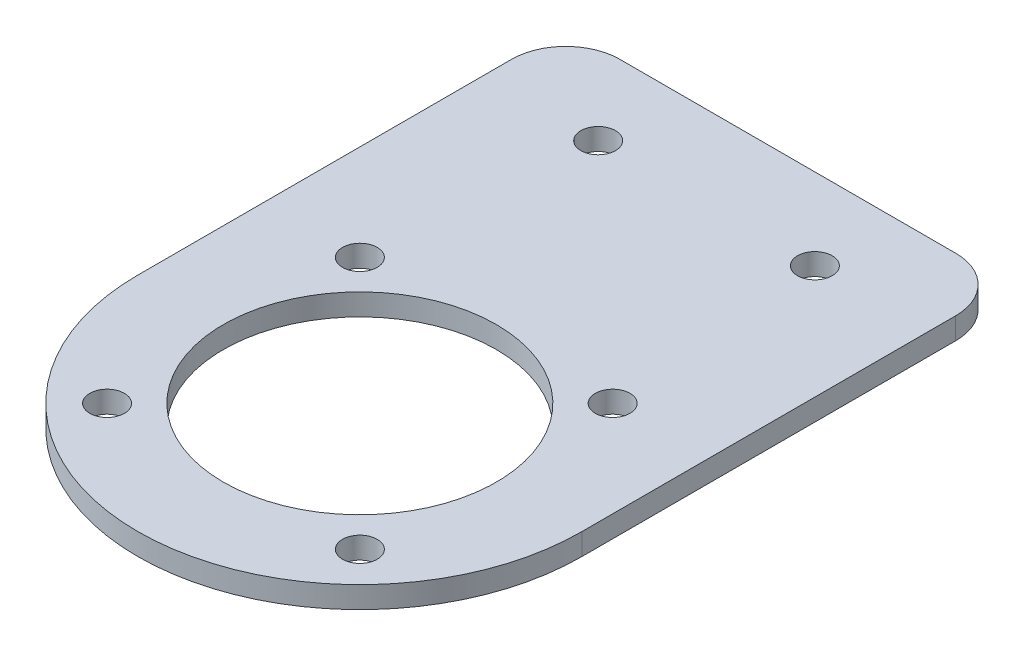
ISO-10303-21;
HEADER;
FILE_DESCRIPTION(('STEP AP214'),'2;1');
FILE_NAME('part.step','',(''),(''),'','','');
FILE_SCHEMA(('AUTOMOTIVE_DESIGN { 1 0 10303 214 1 1 1 1 }'));
ENDSEC;
DATA;
#1=APPLICATION_CONTEXT('core data for automotive mechanical design processes');
#2=APPLICATION_PROTOCOL_DEFINITION('international standard','automotive_design',2000,#1);
#3=PRODUCT_CONTEXT('',#1,'mechanical');
#4=PRODUCT('Part','Part','',(#3));
#5=PRODUCT_RELATED_PRODUCT_CATEGORY('part','',(#4));
#6=PRODUCT_DEFINITION_FORMATION('','',#4);
#7=PRODUCT_DEFINITION_CONTEXT('part definition',#1,'design');
#8=PRODUCT_DEFINITION('design','',#6,#7);
#9=PRODUCT_DEFINITION_SHAPE('','',#8);
#10=(LENGTH_UNIT() NAMED_UNIT(*) SI_UNIT(.MILLI.,.METRE.));
#11=(NAMED_UNIT(*) PLANE_ANGLE_UNIT() SI_UNIT($,.RADIAN.));
#12=(NAMED_UNIT(*) SI_UNIT($,.STERADIAN.) SOLID_ANGLE_UNIT());
#13=UNCERTAINTY_MEASURE_WITH_UNIT(LENGTH_MEASURE(1.E-05),#10,'distance_accuracy_value','');
#14=(GEOMETRIC_REPRESENTATION_CONTEXT(3) GLOBAL_UNCERTAINTY_ASSIGNED_CONTEXT((#13)) GLOBAL_UNIT_ASSIGNED_CONTEXT((#10,
#11,#12)) REPRESENTATION_CONTEXT('',''));
#15=CARTESIAN_POINT('',(0.,0.,0.));
#16=DIRECTION('',(0.,0.,1.));
#17=DIRECTION('',(1.,0.,0.));
#18=AXIS2_PLACEMENT_3D('',#15,#16,#17);
#19=CARTESIAN_POINT('',(-20.5,2.,0.));
#20=DIRECTION('',(-1.,0.,0.));
#21=DIRECTION('',(0.,0.,1.));
#22=AXIS2_PLACEMENT_3D('',#19,#20,#21);
#23=PLANE('',#22);
#24=DIRECTION('',(0.,0.,-1.));
#25=VECTOR('',#24,1.);
#26=CARTESIAN_POINT('',(-20.5,2.,0.));
#27=LINE('',#26,#25);
#28=CARTESIAN_POINT('',(-20.5,2.,0.));
#29=VERTEX_POINT('',#28);
#30=CARTESIAN_POINT('',(-20.5,2.,-34.5));
#31=VERTEX_POINT('',#30);
#32=EDGE_CURVE('E104',#29,#31,#27,.T.);
#33=ORIENTED_EDGE('',*,*,#32,.T.);
#34=DIRECTION('',(0.,-1.,0.));
#35=VECTOR('',#34,1.);
#36=CARTESIAN_POINT('',(-20.5,0.,-34.5));
#37=LINE('',#36,#35);
#38=CARTESIAN_POINT('',(-20.5,0.,-34.5));
#39=VERTEX_POINT('',#38);
#40=EDGE_CURVE('E11',#31,#39,#37,.T.);
#41=ORIENTED_EDGE('',*,*,#40,.T.);
#42=DIRECTION('',(0.,0.,-1.));
#43=VECTOR('',#42,1.);
#44=CARTESIAN_POINT('',(-20.5,0.,0.));
#45=LINE('',#44,#43);
#46=CARTESIAN_POINT('',(-20.5,0.,0.));
#47=VERTEX_POINT('',#46);
#48=EDGE_CURVE('E107',#47,#39,#45,.T.);
#49=ORIENTED_EDGE('',*,*,#48,.F.);
#50=DIRECTION('',(0.,-1.,0.));
#51=VECTOR('',#50,1.);
#52=CARTESIAN_POINT('',(-20.5,2.,0.));
#53=LINE('',#52,#51);
#54=EDGE_CURVE('E102',#29,#47,#53,.T.);
#55=ORIENTED_EDGE('',*,*,#54,.F.);
#56=EDGE_LOOP('',(#33,#41,#49,#55));
#57=FACE_BOUND('',#56,.T.);
#58=ADVANCED_FACE('F46',(#57),#23,.T.);
#59=CARTESIAN_POINT('',(0.,2.,0.));
#60=DIRECTION('',(0.,-1.,0.));
#61=DIRECTION('',(0.,0.,-1.));
#62=AXIS2_PLACEMENT_3D('',#59,#60,#61);
#63=CYLINDRICAL_SURFACE('',#62,20.5);
#64=CARTESIAN_POINT('',(0.,0.,0.));
#65=DIRECTION('',(0.,1.,0.));
#66=DIRECTION('',(0.,0.,1.));
#67=AXIS2_PLACEMENT_3D('',#64,#65,#66);
#68=CIRCLE('',#67,20.5);
#69=CARTESIAN_POINT('',(20.5,0.,0.));
#70=VERTEX_POINT('',#69);
#71=EDGE_CURVE('E169',#47,#70,#68,.T.);
#72=ORIENTED_EDGE('',*,*,#71,.T.);
#73=DIRECTION('',(0.,-1.,0.));
#74=VECTOR('',#73,1.);
#75=CARTESIAN_POINT('',(20.5,2.,0.));
#76=LINE('',#75,#74);
#77=CARTESIAN_POINT('',(20.5,2.,0.));
#78=VERTEX_POINT('',#77);
#79=EDGE_CURVE('E113',#78,#70,#76,.T.);
#80=ORIENTED_EDGE('',*,*,#79,.F.);
#81=CARTESIAN_POINT('',(0.,2.,0.));
#82=DIRECTION('',(0.,1.,0.));
#83=DIRECTION('',(0.,0.,1.));
#84=AXIS2_PLACEMENT_3D('',#81,#82,#83);
#85=CIRCLE('',#84,20.5);
#86=EDGE_CURVE('E117',#29,#78,#85,.T.);
#87=ORIENTED_EDGE('',*,*,#86,.F.);
#88=ORIENTED_EDGE('',*,*,#54,.T.);
#89=EDGE_LOOP('',(#72,#80,#87,#88));
#90=FACE_BOUND('',#89,.T.);
#91=ADVANCED_FACE('F118',(#90),#63,.T.);
#92=CARTESIAN_POINT('',(20.5,2.,0.));
#93=DIRECTION('',(-1.,0.,0.));
#94=DIRECTION('',(0.,0.,1.));
#95=AXIS2_PLACEMENT_3D('',#92,#93,#94);
#96=PLANE('',#95);
#97=DIRECTION('',(0.,0.,-1.));
#98=VECTOR('',#97,1.);
#99=CARTESIAN_POINT('',(20.5,0.,0.));
#100=LINE('',#99,#98);
#101=CARTESIAN_POINT('',(20.5,0.,-34.5));
#102=VERTEX_POINT('',#101);
#103=EDGE_CURVE('E172',#70,#102,#100,.T.);
#104=ORIENTED_EDGE('',*,*,#103,.T.);
#105=DIRECTION('',(0.,-1.,0.));
#106=VECTOR('',#105,1.);
#107=CARTESIAN_POINT('',(20.5,2.,-34.5));
#108=LINE('',#107,#106);
#109=CARTESIAN_POINT('',(20.5,2.,-34.5));
#110=VERTEX_POINT('',#109);
#111=EDGE_CURVE('E70',#102,#110,#108,.F.);
#112=ORIENTED_EDGE('',*,*,#111,.T.);
#113=DIRECTION('',(0.,0.,-1.));
#114=VECTOR('',#113,1.);
#115=CARTESIAN_POINT('',(20.5,2.,0.));
#116=LINE('',#115,#114);
#117=EDGE_CURVE('E121',#78,#110,#116,.T.);
#118=ORIENTED_EDGE('',*,*,#117,.F.);
#119=ORIENTED_EDGE('',*,*,#79,.T.);
#120=EDGE_LOOP('',(#104,#112,#118,#119));
#121=FACE_BOUND('',#120,.T.);
#122=ADVANCED_FACE('F229',(#121),#96,.F.);
#123=CARTESIAN_POINT('',(-11.6672618895781,2.,11.667261889578));
#124=DIRECTION('',(0.,-1.,0.));
#125=DIRECTION('',(0.,0.,-1.));
#126=AXIS2_PLACEMENT_3D('',#123,#124,#125);
#127=CYLINDRICAL_SURFACE('',#126,1.6);
#128=CARTESIAN_POINT('',(-11.6672618895781,2.,11.667261889578));
#129=DIRECTION('',(0.,1.,0.));
#130=DIRECTION('',(0.,0.,1.));
#131=AXIS2_PLACEMENT_3D('',#128,#129,#130);
#132=CIRCLE('',#131,1.6);
#133=CARTESIAN_POINT('',(-11.6672618895781,2.,13.267261889578));
#134=VERTEX_POINT('',#133);
#135=EDGE_CURVE('E151',#134,#134,#132,.T.);
#136=ORIENTED_EDGE('',*,*,#135,.T.);
#137=EDGE_LOOP('',(#136));
#138=FACE_BOUND('',#137,.T.);
#139=CARTESIAN_POINT('',(-11.6672618895781,0.,11.667261889578));
#140=DIRECTION('',(0.,1.,0.));
#141=DIRECTION('',(0.,0.,1.));
#142=AXIS2_PLACEMENT_3D('',#139,#140,#141);
#143=CIRCLE('',#142,1.6);
#144=CARTESIAN_POINT('',(-11.6672618895781,0.,13.267261889578));
#145=VERTEX_POINT('',#144);
#146=EDGE_CURVE('E191',#145,#145,#143,.T.);
#147=ORIENTED_EDGE('',*,*,#146,.F.);
#148=EDGE_LOOP('',(#147));
#149=FACE_BOUND('',#148,.T.);
#150=ADVANCED_FACE('F273',(#138,#149),#127,.F.);
#151=CARTESIAN_POINT('',(-11.667261889578,2.,-11.6672618895781));
#152=DIRECTION('',(0.,-1.,0.));
#153=DIRECTION('',(0.,0.,-1.));
#154=AXIS2_PLACEMENT_3D('',#151,#152,#153);
#155=CYLINDRICAL_SURFACE('',#154,1.6);
#156=CARTESIAN_POINT('',(-11.667261889578,2.,-11.6672618895781));
#157=DIRECTION('',(0.,1.,0.));
#158=DIRECTION('',(0.,0.,1.));
#159=AXIS2_PLACEMENT_3D('',#156,#157,#158);
#160=CIRCLE('',#159,1.6);
#161=CARTESIAN_POINT('',(-11.667261889578,2.,-10.067261889578));
#162=VERTEX_POINT('',#161);
#163=EDGE_CURVE('E147',#162,#162,#160,.T.);
#164=ORIENTED_EDGE('',*,*,#163,.T.);
#165=EDGE_LOOP('',(#164));
#166=FACE_BOUND('',#165,.T.);
#167=CARTESIAN_POINT('',(-11.667261889578,0.,-11.6672618895781));
#168=DIRECTION('',(0.,1.,0.));
#169=DIRECTION('',(0.,0.,1.));
#170=AXIS2_PLACEMENT_3D('',#167,#168,#169);
#171=CIRCLE('',#170,1.6);
#172=CARTESIAN_POINT('',(-11.667261889578,0.,-10.067261889578));
#173=VERTEX_POINT('',#172);
#174=EDGE_CURVE('E187',#173,#173,#171,.T.);
#175=ORIENTED_EDGE('',*,*,#174,.F.);
#176=EDGE_LOOP('',(#175));
#177=FACE_BOUND('',#176,.T.);
#178=ADVANCED_FACE('F276',(#166,#177),#155,.F.);
#179=CARTESIAN_POINT('',(11.6672618895781,2.,-11.667261889578));
#180=DIRECTION('',(0.,-1.,0.));
#181=DIRECTION('',(0.,0.,-1.));
#182=AXIS2_PLACEMENT_3D('',#179,#180,#181);
#183=CYLINDRICAL_SURFACE('',#182,1.60000000000001);
#184=CARTESIAN_POINT('',(11.6672618895781,2.,-11.667261889578));
#185=DIRECTION('',(0.,1.,0.));
#186=DIRECTION('',(0.,0.,1.));
#187=AXIS2_PLACEMENT_3D('',#184,#185,#186);
#188=CIRCLE('',#187,1.60000000000001);
#189=CARTESIAN_POINT('',(11.6672618895781,2.,-10.067261889578));
#190=VERTEX_POINT('',#189);
#191=EDGE_CURVE('E143',#190,#190,#188,.T.);
#192=ORIENTED_EDGE('',*,*,#191,.T.);
#193=EDGE_LOOP('',(#192));
#194=FACE_BOUND('',#193,.T.);
#195=CARTESIAN_POINT('',(11.6672618895781,0.,-11.667261889578));
#196=DIRECTION('',(0.,1.,0.));
#197=DIRECTION('',(0.,0.,1.));
#198=AXIS2_PLACEMENT_3D('',#195,#196,#197);
#199=CIRCLE('',#198,1.60000000000001);
#200=CARTESIAN_POINT('',(11.6672618895781,0.,-10.067261889578));
#201=VERTEX_POINT('',#200);
#202=EDGE_CURVE('E183',#201,#201,#199,.T.);
#203=ORIENTED_EDGE('',*,*,#202,.F.);
#204=EDGE_LOOP('',(#203));
#205=FACE_BOUND('',#204,.T.);
#206=ADVANCED_FACE('F280',(#194,#205),#183,.F.);
#207=CARTESIAN_POINT('',(11.667261889578,2.,11.6672618895781));
#208=DIRECTION('',(0.,-1.,0.));
#209=DIRECTION('',(0.,0.,-1.));
#210=AXIS2_PLACEMENT_3D('',#207,#208,#209);
#211=CYLINDRICAL_SURFACE('',#210,1.6);
#212=CARTESIAN_POINT('',(11.667261889578,2.,11.6672618895781));
#213=DIRECTION('',(0.,1.,0.));
#214=DIRECTION('',(0.,0.,1.));
#215=AXIS2_PLACEMENT_3D('',#212,#213,#214);
#216=CIRCLE('',#215,1.6);
#217=CARTESIAN_POINT('',(11.667261889578,2.,13.2672618895781));
#218=VERTEX_POINT('',#217);
#219=EDGE_CURVE('E139',#218,#218,#216,.T.);
#220=ORIENTED_EDGE('',*,*,#219,.T.);
#221=EDGE_LOOP('',(#220));
#222=FACE_BOUND('',#221,.T.);
#223=CARTESIAN_POINT('',(11.667261889578,0.,11.6672618895781));
#224=DIRECTION('',(0.,1.,0.));
#225=DIRECTION('',(0.,0.,1.));
#226=AXIS2_PLACEMENT_3D('',#223,#224,#225);
#227=CIRCLE('',#226,1.6);
#228=CARTESIAN_POINT('',(11.667261889578,0.,13.2672618895781));
#229=VERTEX_POINT('',#228);
#230=EDGE_CURVE('E179',#229,#229,#227,.T.);
#231=ORIENTED_EDGE('',*,*,#230,.F.);
#232=EDGE_LOOP('',(#231));
#233=FACE_BOUND('',#232,.T.);
#234=ADVANCED_FACE('F284',(#222,#233),#211,.F.);
#235=CARTESIAN_POINT('',(0.,2.,-39.5));
#236=DIRECTION('',(0.,0.,1.));
#237=DIRECTION('',(1.,0.,0.));
#238=AXIS2_PLACEMENT_3D('',#235,#236,#237);
#239=PLANE('',#238);
#240=DIRECTION('',(-1.,0.,0.));
#241=VECTOR('',#240,1.);
#242=CARTESIAN_POINT('',(0.,2.,-39.5));
#243=LINE('',#242,#241);
#244=CARTESIAN_POINT('',(15.5,2.,-39.5));
#245=VERTEX_POINT('',#244);
#246=CARTESIAN_POINT('',(-15.5,2.,-39.5));
#247=VERTEX_POINT('',#246);
#248=EDGE_CURVE('E136',#245,#247,#243,.T.);
#249=ORIENTED_EDGE('',*,*,#248,.F.);
#250=DIRECTION('',(0.,-1.,0.));
#251=VECTOR('',#250,1.);
#252=CARTESIAN_POINT('',(15.5,2.,-39.5));
#253=LINE('',#252,#251);
#254=CARTESIAN_POINT('',(15.5,0.,-39.5));
#255=VERTEX_POINT('',#254);
#256=EDGE_CURVE('E203',#245,#255,#253,.T.);
#257=ORIENTED_EDGE('',*,*,#256,.T.);
#258=DIRECTION('',(-1.,0.,0.));
#259=VECTOR('',#258,1.);
#260=CARTESIAN_POINT('',(0.,0.,-39.5));
#261=LINE('',#260,#259);
#262=CARTESIAN_POINT('',(-15.5,0.,-39.5));
#263=VERTEX_POINT('',#262);
#264=EDGE_CURVE('E175',#255,#263,#261,.T.);
#265=ORIENTED_EDGE('',*,*,#264,.T.);
#266=DIRECTION('',(0.,-1.,0.));
#267=VECTOR('',#266,1.);
#268=CARTESIAN_POINT('',(-15.5,2.,-39.5));
#269=LINE('',#268,#267);
#270=EDGE_CURVE('E112',#263,#247,#269,.F.);
#271=ORIENTED_EDGE('',*,*,#270,.T.);
#272=EDGE_LOOP('',(#249,#257,#265,#271));
#273=FACE_BOUND('',#272,.T.);
#274=ADVANCED_FACE('F222',(#273),#239,.F.);
#275=CARTESIAN_POINT('',(-10.,2.,-32.));
#276=DIRECTION('',(0.,-1.,0.));
#277=DIRECTION('',(0.,0.,-1.));
#278=AXIS2_PLACEMENT_3D('',#275,#276,#277);
#279=CYLINDRICAL_SURFACE('',#278,1.6);
#280=CARTESIAN_POINT('',(-10.,2.,-32.));
#281=DIRECTION('',(0.,1.,0.));
#282=DIRECTION('',(0.,0.,1.));
#283=AXIS2_PLACEMENT_3D('',#280,#281,#282);
#284=CIRCLE('',#283,1.6);
#285=CARTESIAN_POINT('',(-10.,2.,-30.4));
#286=VERTEX_POINT('',#285);
#287=EDGE_CURVE('E126',#286,#286,#284,.T.);
#288=ORIENTED_EDGE('',*,*,#287,.T.);
#289=EDGE_LOOP('',(#288));
#290=FACE_BOUND('',#289,.T.);
#291=CARTESIAN_POINT('',(-10.,0.,-32.));
#292=DIRECTION('',(0.,1.,0.));
#293=DIRECTION('',(0.,0.,1.));
#294=AXIS2_PLACEMENT_3D('',#291,#292,#293);
#295=CIRCLE('',#294,1.6);
#296=CARTESIAN_POINT('',(-10.,0.,-30.4));
#297=VERTEX_POINT('',#296);
#298=EDGE_CURVE('E163',#297,#297,#295,.T.);
#299=ORIENTED_EDGE('',*,*,#298,.F.);
#300=EDGE_LOOP('',(#299));
#301=FACE_BOUND('',#300,.T.);
#302=ADVANCED_FACE('F245',(#290,#301),#279,.F.);
#303=CARTESIAN_POINT('',(10.,2.,-32.));
#304=DIRECTION('',(0.,-1.,0.));
#305=DIRECTION('',(0.,0.,-1.));
#306=AXIS2_PLACEMENT_3D('',#303,#304,#305);
#307=CYLINDRICAL_SURFACE('',#306,1.6);
#308=CARTESIAN_POINT('',(10.,2.,-32.));
#309=DIRECTION('',(0.,1.,0.));
#310=DIRECTION('',(0.,0.,1.));
#311=AXIS2_PLACEMENT_3D('',#308,#309,#310);
#312=CIRCLE('',#311,1.6);
#313=CARTESIAN_POINT('',(10.,2.,-30.4));
#314=VERTEX_POINT('',#313);
#315=EDGE_CURVE('E130',#314,#314,#312,.T.);
#316=ORIENTED_EDGE('',*,*,#315,.T.);
#317=EDGE_LOOP('',(#316));
#318=FACE_BOUND('',#317,.T.);
#319=CARTESIAN_POINT('',(10.,0.,-32.));
#320=DIRECTION('',(0.,1.,0.));
#321=DIRECTION('',(0.,0.,1.));
#322=AXIS2_PLACEMENT_3D('',#319,#320,#321);
#323=CIRCLE('',#322,1.6);
#324=CARTESIAN_POINT('',(10.,0.,-30.4));
#325=VERTEX_POINT('',#324);
#326=EDGE_CURVE('E159',#325,#325,#323,.T.);
#327=ORIENTED_EDGE('',*,*,#326,.F.);
#328=EDGE_LOOP('',(#327));
#329=FACE_BOUND('',#328,.T.);
#330=ADVANCED_FACE('F248',(#318,#329),#307,.F.);
#331=CARTESIAN_POINT('',(0.,2.,0.));
#332=DIRECTION('',(0.,-1.,0.));
#333=DIRECTION('',(0.,0.,-1.));
#334=AXIS2_PLACEMENT_3D('',#331,#332,#333);
#335=CYLINDRICAL_SURFACE('',#334,12.6);
#336=CARTESIAN_POINT('',(0.,2.,0.));
#337=DIRECTION('',(0.,1.,0.));
#338=DIRECTION('',(0.,0.,1.));
#339=AXIS2_PLACEMENT_3D('',#336,#337,#338);
#340=CIRCLE('',#339,12.6);
#341=CARTESIAN_POINT('',(0.,2.,12.6));
#342=VERTEX_POINT('',#341);
#343=EDGE_CURVE('E155',#342,#342,#340,.T.);
#344=ORIENTED_EDGE('',*,*,#343,.T.);
#345=EDGE_LOOP('',(#344));
#346=FACE_BOUND('',#345,.T.);
#347=CARTESIAN_POINT('',(0.,0.,0.));
#348=DIRECTION('',(0.,1.,0.));
#349=DIRECTION('',(0.,0.,1.));
#350=AXIS2_PLACEMENT_3D('',#347,#348,#349);
#351=CIRCLE('',#350,12.6);
#352=CARTESIAN_POINT('',(0.,0.,12.6));
#353=VERTEX_POINT('',#352);
#354=EDGE_CURVE('E195',#353,#353,#351,.T.);
#355=ORIENTED_EDGE('',*,*,#354,.F.);
#356=EDGE_LOOP('',(#355));
#357=FACE_BOUND('',#356,.T.);
#358=ADVANCED_FACE('F251',(#346,#357),#335,.F.);
#359=CARTESIAN_POINT('',(0.,2.,0.));
#360=DIRECTION('',(0.,1.,0.));
#361=DIRECTION('',(0.,0.,1.));
#362=AXIS2_PLACEMENT_3D('',#359,#360,#361);
#363=PLANE('',#362);
#364=ORIENTED_EDGE('',*,*,#315,.F.);
#365=EDGE_LOOP('',(#364));
#366=FACE_BOUND('',#365,.T.);
#367=ORIENTED_EDGE('',*,*,#287,.F.);
#368=EDGE_LOOP('',(#367));
#369=FACE_BOUND('',#368,.T.);
#370=ORIENTED_EDGE('',*,*,#117,.T.);
#371=CARTESIAN_POINT('',(15.5,2.,-34.5));
#372=DIRECTION('',(0.,1.,0.));
#373=DIRECTION('',(0.,0.,1.));
#374=AXIS2_PLACEMENT_3D('',#371,#372,#373);
#375=CIRCLE('',#374,5.);
#376=EDGE_CURVE('E55',#110,#245,#375,.T.);
#377=ORIENTED_EDGE('',*,*,#376,.T.);
#378=ORIENTED_EDGE('',*,*,#248,.T.);
#379=CARTESIAN_POINT('',(-15.5,2.,-34.5));
#380=DIRECTION('',(0.,1.,0.));
#381=DIRECTION('',(0.,0.,1.));
#382=AXIS2_PLACEMENT_3D('',#379,#380,#381);
#383=CIRCLE('',#382,5.);
#384=EDGE_CURVE('E62',#247,#31,#383,.T.);
#385=ORIENTED_EDGE('',*,*,#384,.T.);
#386=ORIENTED_EDGE('',*,*,#32,.F.);
#387=ORIENTED_EDGE('',*,*,#86,.T.);
#388=EDGE_LOOP('',(#370,#377,#378,#385,#386,#387));
#389=FACE_BOUND('',#388,.T.);
#390=ORIENTED_EDGE('',*,*,#219,.F.);
#391=EDGE_LOOP('',(#390));
#392=FACE_BOUND('',#391,.T.);
#393=ORIENTED_EDGE('',*,*,#191,.F.);
#394=EDGE_LOOP('',(#393));
#395=FACE_BOUND('',#394,.T.);
#396=ORIENTED_EDGE('',*,*,#163,.F.);
#397=EDGE_LOOP('',(#396));
#398=FACE_BOUND('',#397,.T.);
#399=ORIENTED_EDGE('',*,*,#135,.F.);
#400=EDGE_LOOP('',(#399));
#401=FACE_BOUND('',#400,.T.);
#402=ORIENTED_EDGE('',*,*,#343,.F.);
#403=EDGE_LOOP('',(#402));
#404=FACE_BOUND('',#403,.T.);
#405=ADVANCED_FACE('F123',(#366,#369,#389,#392,#395,#398,#401,#404),#363,.T.);
#406=CARTESIAN_POINT('',(0.,0.,0.));
#407=DIRECTION('',(0.,1.,0.));
#408=DIRECTION('',(0.,0.,1.));
#409=AXIS2_PLACEMENT_3D('',#406,#407,#408);
#410=PLANE('',#409);
#411=ORIENTED_EDGE('',*,*,#326,.T.);
#412=EDGE_LOOP('',(#411));
#413=FACE_BOUND('',#412,.T.);
#414=ORIENTED_EDGE('',*,*,#298,.T.);
#415=EDGE_LOOP('',(#414));
#416=FACE_BOUND('',#415,.T.);
#417=ORIENTED_EDGE('',*,*,#264,.F.);
#418=CARTESIAN_POINT('',(15.5,0.,-34.5));
#419=DIRECTION('',(0.,1.,0.));
#420=DIRECTION('',(0.,0.,1.));
#421=AXIS2_PLACEMENT_3D('',#418,#419,#420);
#422=CIRCLE('',#421,5.);
#423=EDGE_CURVE('E210',#255,#102,#422,.F.);
#424=ORIENTED_EDGE('',*,*,#423,.T.);
#425=ORIENTED_EDGE('',*,*,#103,.F.);
#426=ORIENTED_EDGE('',*,*,#71,.F.);
#427=ORIENTED_EDGE('',*,*,#48,.T.);
#428=CARTESIAN_POINT('',(-15.5,0.,-34.5));
#429=DIRECTION('',(0.,1.,0.));
#430=DIRECTION('',(0.,0.,1.));
#431=AXIS2_PLACEMENT_3D('',#428,#429,#430);
#432=CIRCLE('',#431,5.);
#433=EDGE_CURVE('E207',#39,#263,#432,.F.);
#434=ORIENTED_EDGE('',*,*,#433,.T.);
#435=EDGE_LOOP('',(#417,#424,#425,#426,#427,#434));
#436=FACE_BOUND('',#435,.T.);
#437=ORIENTED_EDGE('',*,*,#230,.T.);
#438=EDGE_LOOP('',(#437));
#439=FACE_BOUND('',#438,.T.);
#440=ORIENTED_EDGE('',*,*,#202,.T.);
#441=EDGE_LOOP('',(#440));
#442=FACE_BOUND('',#441,.T.);
#443=ORIENTED_EDGE('',*,*,#174,.T.);
#444=EDGE_LOOP('',(#443));
#445=FACE_BOUND('',#444,.T.);
#446=ORIENTED_EDGE('',*,*,#146,.T.);
#447=EDGE_LOOP('',(#446));
#448=FACE_BOUND('',#447,.T.);
#449=ORIENTED_EDGE('',*,*,#354,.T.);
#450=EDGE_LOOP('',(#449));
#451=FACE_BOUND('',#450,.T.);
#452=ADVANCED_FACE('F227',(#413,#416,#436,#439,#442,#445,#448,#451),#410,.F.);
#453=CARTESIAN_POINT('',(15.5,2.,-34.5));
#454=DIRECTION('',(0.,-1.,0.));
#455=DIRECTION('',(0.,0.,-1.));
#456=AXIS2_PLACEMENT_3D('',#453,#454,#455);
#457=CYLINDRICAL_SURFACE('',#456,5.);
#458=ORIENTED_EDGE('',*,*,#376,.F.);
#459=ORIENTED_EDGE('',*,*,#111,.F.);
#460=ORIENTED_EDGE('',*,*,#423,.F.);
#461=ORIENTED_EDGE('',*,*,#256,.F.);
#462=EDGE_LOOP('',(#458,#459,#460,#461));
#463=FACE_BOUND('',#462,.T.);
#464=ADVANCED_FACE('F225',(#463),#457,.T.);
#465=CARTESIAN_POINT('',(-15.5,2.,-34.5));
#466=DIRECTION('',(0.,1.,0.));
#467=DIRECTION('',(0.,0.,1.));
#468=AXIS2_PLACEMENT_3D('',#465,#466,#467);
#469=CYLINDRICAL_SURFACE('',#468,5.);
#470=ORIENTED_EDGE('',*,*,#384,.F.);
#471=ORIENTED_EDGE('',*,*,#270,.F.);
#472=ORIENTED_EDGE('',*,*,#433,.F.);
#473=ORIENTED_EDGE('',*,*,#40,.F.);
#474=EDGE_LOOP('',(#470,#471,#472,#473));
#475=FACE_BOUND('',#474,.T.);
#476=ADVANCED_FACE('F48',(#475),#469,.T.);
#477=CLOSED_SHELL('',(#58,#91,#122,#150,#178,#206,#234,#274,#302,#330,#358,#405,#452,#464,#476));
#478=MANIFOLD_SOLID_BREP('B2',#477);
#479=ADVANCED_BREP_SHAPE_REPRESENTATION('',(#18,#478),#14);
#480=SHAPE_DEFINITION_REPRESENTATION(#9,#479);
ENDSEC;
END-ISO-10303-21;
